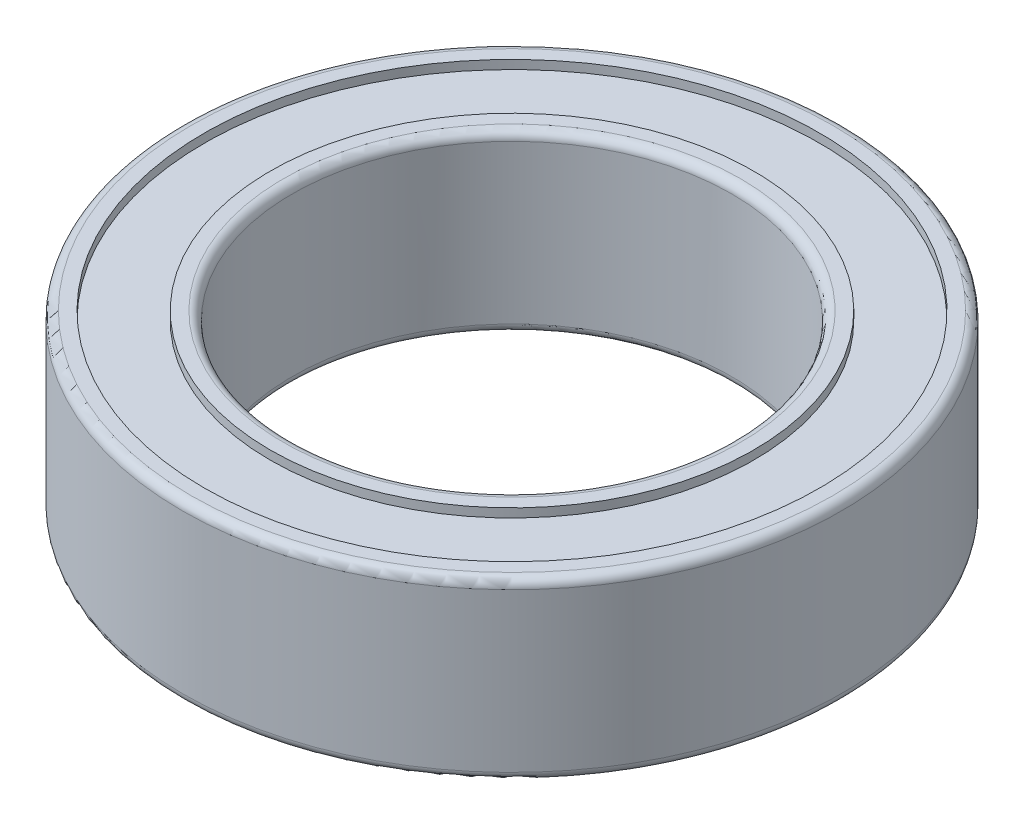
ISO-10303-21;
HEADER;
FILE_DESCRIPTION(('STEP AP214'),'2;1');
FILE_NAME('part.step','',(''),(''),'','','');
FILE_SCHEMA(('AUTOMOTIVE_DESIGN { 1 0 10303 214 1 1 1 1 }'));
ENDSEC;
DATA;
#1=APPLICATION_CONTEXT('core data for automotive mechanical design processes');
#2=APPLICATION_PROTOCOL_DEFINITION('international standard','automotive_design',2000,#1);
#3=PRODUCT_CONTEXT('',#1,'mechanical');
#4=PRODUCT('Part','Part','',(#3));
#5=PRODUCT_RELATED_PRODUCT_CATEGORY('part','',(#4));
#6=PRODUCT_DEFINITION_FORMATION('','',#4);
#7=PRODUCT_DEFINITION_CONTEXT('part definition',#1,'design');
#8=PRODUCT_DEFINITION('design','',#6,#7);
#9=PRODUCT_DEFINITION_SHAPE('','',#8);
#10=(LENGTH_UNIT() NAMED_UNIT(*) SI_UNIT(.MILLI.,.METRE.));
#11=(NAMED_UNIT(*) PLANE_ANGLE_UNIT() SI_UNIT($,.RADIAN.));
#12=(NAMED_UNIT(*) SI_UNIT($,.STERADIAN.) SOLID_ANGLE_UNIT());
#13=UNCERTAINTY_MEASURE_WITH_UNIT(LENGTH_MEASURE(1.E-05),#10,'distance_accuracy_value','');
#14=(GEOMETRIC_REPRESENTATION_CONTEXT(3) GLOBAL_UNCERTAINTY_ASSIGNED_CONTEXT((#13)) GLOBAL_UNIT_ASSIGNED_CONTEXT((#10,
#11,#12)) REPRESENTATION_CONTEXT('',''));
#15=CARTESIAN_POINT('',(0.,0.,0.));
#16=DIRECTION('',(0.,0.,1.));
#17=DIRECTION('',(1.,0.,0.));
#18=AXIS2_PLACEMENT_3D('',#15,#16,#17);
#19=CARTESIAN_POINT('',(0.,2.,-5.5));
#20=DIRECTION('',(0.,-1.,0.));
#21=DIRECTION('',(0.,0.,-1.));
#22=AXIS2_PLACEMENT_3D('',#19,#20,#21);
#23=PLANE('',#22);
#24=CARTESIAN_POINT('',(0.,2.,0.));
#25=DIRECTION('',(0.,-1.,0.));
#26=DIRECTION('',(0.,0.,-1.));
#27=AXIS2_PLACEMENT_3D('',#24,#25,#26);
#28=CIRCLE('',#27,5.2);
#29=CARTESIAN_POINT('',(0.,2.,-5.2));
#30=VERTEX_POINT('',#29);
#31=EDGE_CURVE('E53',#30,#30,#28,.T.);
#32=ORIENTED_EDGE('',*,*,#31,.T.);
#33=EDGE_LOOP('',(#32));
#34=FACE_BOUND('',#33,.T.);
#35=CARTESIAN_POINT('',(0.,2.,0.));
#36=DIRECTION('',(0.,1.,0.));
#37=DIRECTION('',(0.,0.,1.));
#38=AXIS2_PLACEMENT_3D('',#35,#36,#37);
#39=CIRCLE('',#38,5.5);
#40=CARTESIAN_POINT('',(0.,2.,5.5));
#41=VERTEX_POINT('',#40);
#42=EDGE_CURVE('E83',#41,#41,#39,.T.);
#43=ORIENTED_EDGE('',*,*,#42,.T.);
#44=EDGE_LOOP('',(#43));
#45=FACE_BOUND('',#44,.T.);
#46=ADVANCED_FACE('F30',(#34,#45),#23,.F.);
#47=CARTESIAN_POINT('',(0.,1.19367588932806,0.));
#48=DIRECTION('',(0.,1.,0.));
#49=DIRECTION('',(0.,0.,1.));
#50=AXIS2_PLACEMENT_3D('',#47,#48,#49);
#51=CYLINDRICAL_SURFACE('',#50,5.);
#52=CARTESIAN_POINT('',(0.,1.8,0.));
#53=DIRECTION('',(0.,-1.,0.));
#54=DIRECTION('',(0.,0.,-1.));
#55=AXIS2_PLACEMENT_3D('',#52,#53,#54);
#56=CIRCLE('',#55,5.);
#57=CARTESIAN_POINT('',(0.,1.8,-5.));
#58=VERTEX_POINT('',#57);
#59=EDGE_CURVE('E56',#58,#58,#56,.F.);
#60=ORIENTED_EDGE('',*,*,#59,.T.);
#61=EDGE_LOOP('',(#60));
#62=FACE_BOUND('',#61,.T.);
#63=CARTESIAN_POINT('',(0.,-1.8,0.));
#64=DIRECTION('',(0.,1.,0.));
#65=DIRECTION('',(0.,0.,1.));
#66=AXIS2_PLACEMENT_3D('',#63,#64,#65);
#67=CIRCLE('',#66,5.);
#68=CARTESIAN_POINT('',(0.,-1.8,5.));
#69=VERTEX_POINT('',#68);
#70=EDGE_CURVE('E59',#69,#69,#67,.F.);
#71=ORIENTED_EDGE('',*,*,#70,.T.);
#72=EDGE_LOOP('',(#71));
#73=FACE_BOUND('',#72,.T.);
#74=ADVANCED_FACE('F118',(#62,#73),#51,.F.);
#75=CARTESIAN_POINT('',(0.,-2.,-5.));
#76=DIRECTION('',(0.,1.,0.));
#77=DIRECTION('',(0.,0.,1.));
#78=AXIS2_PLACEMENT_3D('',#75,#76,#77);
#79=PLANE('',#78);
#80=CARTESIAN_POINT('',(0.,-2.,0.));
#81=DIRECTION('',(0.,1.,0.));
#82=DIRECTION('',(0.,0.,1.));
#83=AXIS2_PLACEMENT_3D('',#80,#81,#82);
#84=CIRCLE('',#83,5.2);
#85=CARTESIAN_POINT('',(0.,-2.,5.2));
#86=VERTEX_POINT('',#85);
#87=EDGE_CURVE('E50',#86,#86,#84,.T.);
#88=ORIENTED_EDGE('',*,*,#87,.T.);
#89=EDGE_LOOP('',(#88));
#90=FACE_BOUND('',#89,.T.);
#91=CARTESIAN_POINT('',(0.,-2.,0.));
#92=DIRECTION('',(0.,1.,0.));
#93=DIRECTION('',(0.,0.,1.));
#94=AXIS2_PLACEMENT_3D('',#91,#92,#93);
#95=CIRCLE('',#94,5.5);
#96=CARTESIAN_POINT('',(0.,-2.,5.5));
#97=VERTEX_POINT('',#96);
#98=EDGE_CURVE('E62',#97,#97,#95,.T.);
#99=ORIENTED_EDGE('',*,*,#98,.F.);
#100=EDGE_LOOP('',(#99));
#101=FACE_BOUND('',#100,.T.);
#102=ADVANCED_FACE('F124',(#90,#101),#79,.F.);
#103=CARTESIAN_POINT('',(0.,1.19367588932806,0.));
#104=DIRECTION('',(0.,1.,0.));
#105=DIRECTION('',(0.,0.,1.));
#106=AXIS2_PLACEMENT_3D('',#103,#104,#105);
#107=CYLINDRICAL_SURFACE('',#106,5.5);
#108=CARTESIAN_POINT('',(0.,-1.8,0.));
#109=DIRECTION('',(0.,1.,0.));
#110=DIRECTION('',(0.,0.,1.));
#111=AXIS2_PLACEMENT_3D('',#108,#109,#110);
#112=CIRCLE('',#111,5.5);
#113=CARTESIAN_POINT('',(0.,-1.8,5.5));
#114=VERTEX_POINT('',#113);
#115=EDGE_CURVE('E65',#114,#114,#112,.T.);
#116=ORIENTED_EDGE('',*,*,#115,.F.);
#117=EDGE_LOOP('',(#116));
#118=FACE_BOUND('',#117,.T.);
#119=ORIENTED_EDGE('',*,*,#98,.T.);
#120=EDGE_LOOP('',(#119));
#121=FACE_BOUND('',#120,.T.);
#122=ADVANCED_FACE('F197',(#118,#121),#107,.T.);
#123=CARTESIAN_POINT('',(0.,-1.8,-5.5));
#124=DIRECTION('',(0.,1.,0.));
#125=DIRECTION('',(0.,0.,1.));
#126=AXIS2_PLACEMENT_3D('',#123,#124,#125);
#127=PLANE('',#126);
#128=CARTESIAN_POINT('',(0.,-1.8,0.));
#129=DIRECTION('',(0.,1.,0.));
#130=DIRECTION('',(0.,0.,1.));
#131=AXIS2_PLACEMENT_3D('',#128,#129,#130);
#132=CIRCLE('',#131,7.);
#133=CARTESIAN_POINT('',(0.,-1.8,7.));
#134=VERTEX_POINT('',#133);
#135=EDGE_CURVE('E68',#134,#134,#132,.T.);
#136=ORIENTED_EDGE('',*,*,#135,.F.);
#137=EDGE_LOOP('',(#136));
#138=FACE_BOUND('',#137,.T.);
#139=ORIENTED_EDGE('',*,*,#115,.T.);
#140=EDGE_LOOP('',(#139));
#141=FACE_BOUND('',#140,.T.);
#142=ADVANCED_FACE('F232',(#138,#141),#127,.F.);
#143=CARTESIAN_POINT('',(0.,1.19367588932806,0.));
#144=DIRECTION('',(0.,1.,0.));
#145=DIRECTION('',(0.,0.,1.));
#146=AXIS2_PLACEMENT_3D('',#143,#144,#145);
#147=CYLINDRICAL_SURFACE('',#146,7.);
#148=CARTESIAN_POINT('',(0.,-2.,0.));
#149=DIRECTION('',(0.,1.,0.));
#150=DIRECTION('',(0.,0.,1.));
#151=AXIS2_PLACEMENT_3D('',#148,#149,#150);
#152=CIRCLE('',#151,7.);
#153=CARTESIAN_POINT('',(0.,-2.,7.));
#154=VERTEX_POINT('',#153);
#155=EDGE_CURVE('E71',#154,#154,#152,.T.);
#156=ORIENTED_EDGE('',*,*,#155,.F.);
#157=EDGE_LOOP('',(#156));
#158=FACE_BOUND('',#157,.T.);
#159=ORIENTED_EDGE('',*,*,#135,.T.);
#160=EDGE_LOOP('',(#159));
#161=FACE_BOUND('',#160,.T.);
#162=ADVANCED_FACE('F186',(#158,#161),#147,.F.);
#163=CARTESIAN_POINT('',(0.,-2.,-7.));
#164=DIRECTION('',(0.,1.,0.));
#165=DIRECTION('',(0.,0.,1.));
#166=AXIS2_PLACEMENT_3D('',#163,#164,#165);
#167=PLANE('',#166);
#168=CARTESIAN_POINT('',(0.,-2.,0.));
#169=DIRECTION('',(0.,1.,0.));
#170=DIRECTION('',(0.,0.,1.));
#171=AXIS2_PLACEMENT_3D('',#168,#169,#170);
#172=CIRCLE('',#171,7.3);
#173=CARTESIAN_POINT('',(0.,-2.,7.3));
#174=VERTEX_POINT('',#173);
#175=EDGE_CURVE('E37',#174,#174,#172,.F.);
#176=ORIENTED_EDGE('',*,*,#175,.T.);
#177=EDGE_LOOP('',(#176));
#178=FACE_BOUND('',#177,.T.);
#179=ORIENTED_EDGE('',*,*,#155,.T.);
#180=EDGE_LOOP('',(#179));
#181=FACE_BOUND('',#180,.T.);
#182=ADVANCED_FACE('F114',(#178,#181),#167,.F.);
#183=CARTESIAN_POINT('',(0.,1.19367588932806,0.));
#184=DIRECTION('',(0.,1.,0.));
#185=DIRECTION('',(0.,0.,1.));
#186=AXIS2_PLACEMENT_3D('',#183,#184,#185);
#187=CYLINDRICAL_SURFACE('',#186,7.5);
#188=CARTESIAN_POINT('',(0.,-1.8,0.));
#189=DIRECTION('',(0.,1.,0.));
#190=DIRECTION('',(0.,0.,1.));
#191=AXIS2_PLACEMENT_3D('',#188,#189,#190);
#192=CIRCLE('',#191,7.5);
#193=CARTESIAN_POINT('',(0.,-1.8,7.5));
#194=VERTEX_POINT('',#193);
#195=EDGE_CURVE('E41',#194,#194,#192,.T.);
#196=ORIENTED_EDGE('',*,*,#195,.T.);
#197=EDGE_LOOP('',(#196));
#198=FACE_BOUND('',#197,.T.);
#199=CARTESIAN_POINT('',(0.,1.8,0.));
#200=DIRECTION('',(0.,-1.,0.));
#201=DIRECTION('',(0.,0.,-1.));
#202=AXIS2_PLACEMENT_3D('',#199,#200,#201);
#203=CIRCLE('',#202,7.5);
#204=CARTESIAN_POINT('',(0.,1.8,-7.5));
#205=VERTEX_POINT('',#204);
#206=EDGE_CURVE('E45',#205,#205,#203,.T.);
#207=ORIENTED_EDGE('',*,*,#206,.T.);
#208=EDGE_LOOP('',(#207));
#209=FACE_BOUND('',#208,.T.);
#210=ADVANCED_FACE('F109',(#198,#209),#187,.T.);
#211=CARTESIAN_POINT('',(0.,2.,-7.5));
#212=DIRECTION('',(0.,-1.,0.));
#213=DIRECTION('',(0.,0.,-1.));
#214=AXIS2_PLACEMENT_3D('',#211,#212,#213);
#215=PLANE('',#214);
#216=CARTESIAN_POINT('',(0.,2.,0.));
#217=DIRECTION('',(0.,-1.,0.));
#218=DIRECTION('',(0.,0.,-1.));
#219=AXIS2_PLACEMENT_3D('',#216,#217,#218);
#220=CIRCLE('',#219,7.3);
#221=CARTESIAN_POINT('',(0.,2.,-7.3));
#222=VERTEX_POINT('',#221);
#223=EDGE_CURVE('E10',#222,#222,#220,.F.);
#224=ORIENTED_EDGE('',*,*,#223,.T.);
#225=EDGE_LOOP('',(#224));
#226=FACE_BOUND('',#225,.T.);
#227=CARTESIAN_POINT('',(0.,2.,0.));
#228=DIRECTION('',(0.,1.,0.));
#229=DIRECTION('',(0.,0.,1.));
#230=AXIS2_PLACEMENT_3D('',#227,#228,#229);
#231=CIRCLE('',#230,7.);
#232=CARTESIAN_POINT('',(0.,2.,7.));
#233=VERTEX_POINT('',#232);
#234=EDGE_CURVE('E74',#233,#233,#231,.T.);
#235=ORIENTED_EDGE('',*,*,#234,.F.);
#236=EDGE_LOOP('',(#235));
#237=FACE_BOUND('',#236,.T.);
#238=ADVANCED_FACE('F104',(#226,#237),#215,.F.);
#239=CARTESIAN_POINT('',(0.,1.19367588932806,0.));
#240=DIRECTION('',(0.,1.,0.));
#241=DIRECTION('',(0.,0.,1.));
#242=AXIS2_PLACEMENT_3D('',#239,#240,#241);
#243=CYLINDRICAL_SURFACE('',#242,7.);
#244=CARTESIAN_POINT('',(0.,1.8,0.));
#245=DIRECTION('',(0.,1.,0.));
#246=DIRECTION('',(0.,0.,1.));
#247=AXIS2_PLACEMENT_3D('',#244,#245,#246);
#248=CIRCLE('',#247,7.);
#249=CARTESIAN_POINT('',(0.,1.8,7.));
#250=VERTEX_POINT('',#249);
#251=EDGE_CURVE('E77',#250,#250,#248,.T.);
#252=ORIENTED_EDGE('',*,*,#251,.F.);
#253=EDGE_LOOP('',(#252));
#254=FACE_BOUND('',#253,.T.);
#255=ORIENTED_EDGE('',*,*,#234,.T.);
#256=EDGE_LOOP('',(#255));
#257=FACE_BOUND('',#256,.T.);
#258=ADVANCED_FACE('F98',(#254,#257),#243,.F.);
#259=CARTESIAN_POINT('',(0.,1.8,-7.));
#260=DIRECTION('',(0.,-1.,0.));
#261=DIRECTION('',(0.,0.,-1.));
#262=AXIS2_PLACEMENT_3D('',#259,#260,#261);
#263=PLANE('',#262);
#264=CARTESIAN_POINT('',(0.,1.8,0.));
#265=DIRECTION('',(0.,1.,0.));
#266=DIRECTION('',(0.,0.,1.));
#267=AXIS2_PLACEMENT_3D('',#264,#265,#266);
#268=CIRCLE('',#267,5.5);
#269=CARTESIAN_POINT('',(0.,1.8,5.5));
#270=VERTEX_POINT('',#269);
#271=EDGE_CURVE('E80',#270,#270,#268,.T.);
#272=ORIENTED_EDGE('',*,*,#271,.F.);
#273=EDGE_LOOP('',(#272));
#274=FACE_BOUND('',#273,.T.);
#275=ORIENTED_EDGE('',*,*,#251,.T.);
#276=EDGE_LOOP('',(#275));
#277=FACE_BOUND('',#276,.T.);
#278=ADVANCED_FACE('F92',(#274,#277),#263,.F.);
#279=CARTESIAN_POINT('',(0.,1.19367588932806,0.));
#280=DIRECTION('',(0.,1.,0.));
#281=DIRECTION('',(0.,0.,1.));
#282=AXIS2_PLACEMENT_3D('',#279,#280,#281);
#283=CYLINDRICAL_SURFACE('',#282,5.5);
#284=ORIENTED_EDGE('',*,*,#42,.F.);
#285=EDGE_LOOP('',(#284));
#286=FACE_BOUND('',#285,.T.);
#287=ORIENTED_EDGE('',*,*,#271,.T.);
#288=EDGE_LOOP('',(#287));
#289=FACE_BOUND('',#288,.T.);
#290=ADVANCED_FACE('F88',(#286,#289),#283,.T.);
#291=CARTESIAN_POINT('',(0.,1.8,0.));
#292=DIRECTION('',(0.,-1.,0.));
#293=DIRECTION('',(0.,0.,-1.));
#294=AXIS2_PLACEMENT_3D('',#291,#292,#293);
#295=TOROIDAL_SURFACE('',#294,5.2,0.2);
#296=ORIENTED_EDGE('',*,*,#31,.F.);
#297=EDGE_LOOP('',(#296));
#298=FACE_BOUND('',#297,.T.);
#299=ORIENTED_EDGE('',*,*,#59,.F.);
#300=EDGE_LOOP('',(#299));
#301=FACE_BOUND('',#300,.T.);
#302=ADVANCED_FACE('F91',(#298,#301),#295,.T.);
#303=CARTESIAN_POINT('',(0.,-1.8,0.));
#304=DIRECTION('',(0.,1.,0.));
#305=DIRECTION('',(0.,0.,1.));
#306=AXIS2_PLACEMENT_3D('',#303,#304,#305);
#307=TOROIDAL_SURFACE('',#306,5.2,0.2);
#308=ORIENTED_EDGE('',*,*,#70,.F.);
#309=EDGE_LOOP('',(#308));
#310=FACE_BOUND('',#309,.T.);
#311=ORIENTED_EDGE('',*,*,#87,.F.);
#312=EDGE_LOOP('',(#311));
#313=FACE_BOUND('',#312,.T.);
#314=ADVANCED_FACE('F131',(#310,#313),#307,.T.);
#315=CARTESIAN_POINT('',(0.,-1.8,0.));
#316=DIRECTION('',(0.,1.,0.));
#317=DIRECTION('',(0.,0.,1.));
#318=AXIS2_PLACEMENT_3D('',#315,#316,#317);
#319=TOROIDAL_SURFACE('',#318,7.3,0.2);
#320=ORIENTED_EDGE('',*,*,#175,.F.);
#321=EDGE_LOOP('',(#320));
#322=FACE_BOUND('',#321,.T.);
#323=ORIENTED_EDGE('',*,*,#195,.F.);
#324=EDGE_LOOP('',(#323));
#325=FACE_BOUND('',#324,.T.);
#326=ADVANCED_FACE('F134',(#322,#325),#319,.T.);
#327=CARTESIAN_POINT('',(0.,1.8,0.));
#328=DIRECTION('',(0.,-1.,0.));
#329=DIRECTION('',(0.,0.,-1.));
#330=AXIS2_PLACEMENT_3D('',#327,#328,#329);
#331=TOROIDAL_SURFACE('',#330,7.3,0.2);
#332=ORIENTED_EDGE('',*,*,#206,.F.);
#333=EDGE_LOOP('',(#332));
#334=FACE_BOUND('',#333,.T.);
#335=ORIENTED_EDGE('',*,*,#223,.F.);
#336=EDGE_LOOP('',(#335));
#337=FACE_BOUND('',#336,.T.);
#338=ADVANCED_FACE('F32',(#334,#337),#331,.T.);
#339=CLOSED_SHELL('',(#46,#74,#102,#122,#142,#162,#182,#210,#238,#258,#278,#290,#302,#314,#326,#338));
#340=MANIFOLD_SOLID_BREP('B2',#339);
#341=ADVANCED_BREP_SHAPE_REPRESENTATION('',(#18,#340),#14);
#342=SHAPE_DEFINITION_REPRESENTATION(#9,#341);
ENDSEC;
END-ISO-10303-21;
